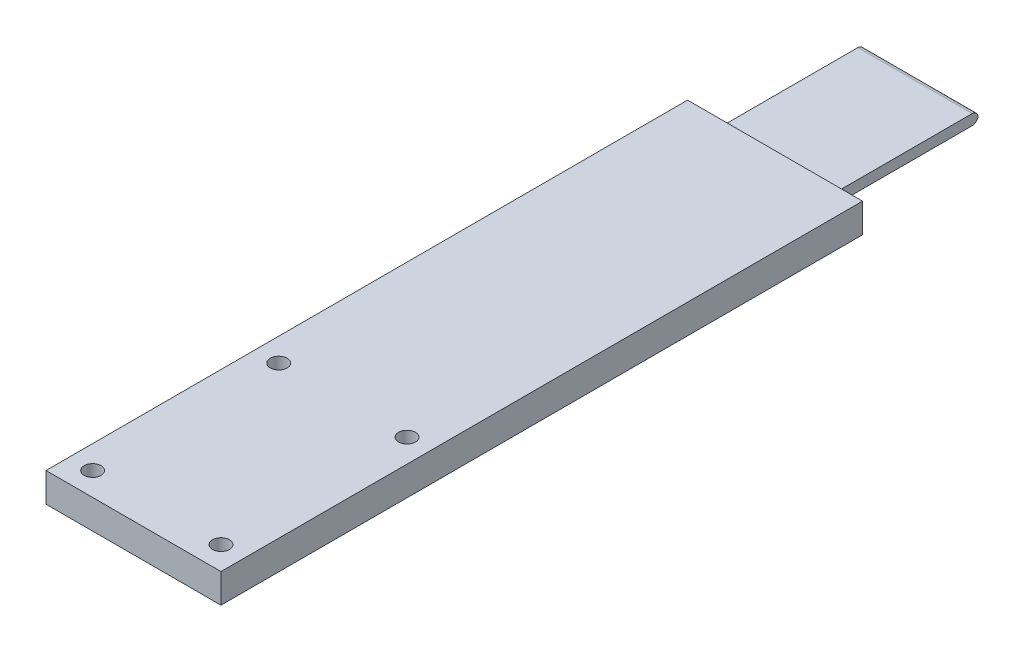
ISO-10303-21;
HEADER;
FILE_DESCRIPTION(('STEP AP214'),'2;1');
FILE_NAME('part.step','',(''),(''),'','','');
FILE_SCHEMA(('AUTOMOTIVE_DESIGN { 1 0 10303 214 1 1 1 1 }'));
ENDSEC;
DATA;
#1=APPLICATION_CONTEXT('core data for automotive mechanical design processes');
#2=APPLICATION_PROTOCOL_DEFINITION('international standard','automotive_design',2000,#1);
#3=PRODUCT_CONTEXT('',#1,'mechanical');
#4=PRODUCT('Part','Part','',(#3));
#5=PRODUCT_RELATED_PRODUCT_CATEGORY('part','',(#4));
#6=PRODUCT_DEFINITION_FORMATION('','',#4);
#7=PRODUCT_DEFINITION_CONTEXT('part definition',#1,'design');
#8=PRODUCT_DEFINITION('design','',#6,#7);
#9=PRODUCT_DEFINITION_SHAPE('','',#8);
#10=(LENGTH_UNIT() NAMED_UNIT(*) SI_UNIT(.MILLI.,.METRE.));
#11=(NAMED_UNIT(*) PLANE_ANGLE_UNIT() SI_UNIT($,.RADIAN.));
#12=(NAMED_UNIT(*) SI_UNIT($,.STERADIAN.) SOLID_ANGLE_UNIT());
#13=UNCERTAINTY_MEASURE_WITH_UNIT(LENGTH_MEASURE(1.E-05),#10,'distance_accuracy_value','');
#14=(GEOMETRIC_REPRESENTATION_CONTEXT(3) GLOBAL_UNCERTAINTY_ASSIGNED_CONTEXT((#13)) GLOBAL_UNIT_ASSIGNED_CONTEXT((#10,
#11,#12)) REPRESENTATION_CONTEXT('',''));
#15=CARTESIAN_POINT('',(0.,0.,0.));
#16=DIRECTION('',(0.,0.,1.));
#17=DIRECTION('',(1.,0.,0.));
#18=AXIS2_PLACEMENT_3D('',#15,#16,#17);
#19=CARTESIAN_POINT('',(0.,0.,0.));
#20=DIRECTION('',(0.,0.,1.));
#21=DIRECTION('',(1.,0.,0.));
#22=AXIS2_PLACEMENT_3D('',#19,#20,#21);
#23=PLANE('',#22);
#24=DIRECTION('',(0.,1.,0.));
#25=VECTOR('',#24,1.);
#26=CARTESIAN_POINT('',(0.,0.,0.));
#27=LINE('',#26,#25);
#28=CARTESIAN_POINT('',(0.,0.,0.));
#29=VERTEX_POINT('',#28);
#30=CARTESIAN_POINT('',(0.,5.00000000000001,0.));
#31=VERTEX_POINT('',#30);
#32=EDGE_CURVE('E160',#29,#31,#27,.T.);
#33=ORIENTED_EDGE('',*,*,#32,.F.);
#34=DIRECTION('',(1.,0.,0.));
#35=VECTOR('',#34,1.);
#36=CARTESIAN_POINT('',(0.,0.,0.));
#37=LINE('',#36,#35);
#38=CARTESIAN_POINT('',(-30.,0.,0.));
#39=VERTEX_POINT('',#38);
#40=EDGE_CURVE('E153',#39,#29,#37,.T.);
#41=ORIENTED_EDGE('',*,*,#40,.F.);
#42=DIRECTION('',(0.,-1.,0.));
#43=VECTOR('',#42,1.);
#44=CARTESIAN_POINT('',(-30.,0.,0.));
#45=LINE('',#44,#43);
#46=CARTESIAN_POINT('',(-30.,5.,0.));
#47=VERTEX_POINT('',#46);
#48=EDGE_CURVE('E166',#47,#39,#45,.T.);
#49=ORIENTED_EDGE('',*,*,#48,.F.);
#50=DIRECTION('',(-1.,0.,0.));
#51=VECTOR('',#50,1.);
#52=CARTESIAN_POINT('',(0.,5.00000000000001,0.));
#53=LINE('',#52,#51);
#54=EDGE_CURVE('E163',#31,#47,#53,.T.);
#55=ORIENTED_EDGE('',*,*,#54,.F.);
#56=EDGE_LOOP('',(#33,#41,#49,#55));
#57=FACE_BOUND('',#56,.T.);
#58=DIRECTION('',(0.,-1.,0.));
#59=VECTOR('',#58,1.);
#60=CARTESIAN_POINT('',(-5.2,3.40000000000001,0.));
#61=LINE('',#60,#59);
#62=CARTESIAN_POINT('',(-5.2,3.40000000000001,0.));
#63=VERTEX_POINT('',#62);
#64=CARTESIAN_POINT('',(-5.2,1.6,0.));
#65=VERTEX_POINT('',#64);
#66=EDGE_CURVE('E127',#63,#65,#61,.T.);
#67=ORIENTED_EDGE('',*,*,#66,.F.);
#68=DIRECTION('',(1.,0.,0.));
#69=VECTOR('',#68,1.);
#70=CARTESIAN_POINT('',(-5.2,3.40000000000001,0.));
#71=LINE('',#70,#69);
#72=CARTESIAN_POINT('',(-24.8,3.40000000000001,0.));
#73=VERTEX_POINT('',#72);
#74=EDGE_CURVE('E124',#73,#63,#71,.T.);
#75=ORIENTED_EDGE('',*,*,#74,.F.);
#76=DIRECTION('',(0.,1.,0.));
#77=VECTOR('',#76,1.);
#78=CARTESIAN_POINT('',(-24.8,3.40000000000001,0.));
#79=LINE('',#78,#77);
#80=CARTESIAN_POINT('',(-24.8,1.6,0.));
#81=VERTEX_POINT('',#80);
#82=EDGE_CURVE('E107',#81,#73,#79,.T.);
#83=ORIENTED_EDGE('',*,*,#82,.F.);
#84=DIRECTION('',(-1.,0.,0.));
#85=VECTOR('',#84,1.);
#86=CARTESIAN_POINT('',(-5.2,1.6,0.));
#87=LINE('',#86,#85);
#88=EDGE_CURVE('E121',#65,#81,#87,.T.);
#89=ORIENTED_EDGE('',*,*,#88,.F.);
#90=EDGE_LOOP('',(#67,#75,#83,#89));
#91=FACE_BOUND('',#90,.T.);
#92=ADVANCED_FACE('F35',(#57,#91),#23,.F.);
#93=CARTESIAN_POINT('',(0.,0.,110.));
#94=DIRECTION('',(-1.,0.,0.));
#95=DIRECTION('',(0.,-1.,0.));
#96=AXIS2_PLACEMENT_3D('',#93,#94,#95);
#97=PLANE('',#96);
#98=ORIENTED_EDGE('',*,*,#32,.T.);
#99=DIRECTION('',(0.,0.,-1.));
#100=VECTOR('',#99,1.);
#101=CARTESIAN_POINT('',(0.,5.00000000000001,110.));
#102=LINE('',#101,#100);
#103=CARTESIAN_POINT('',(0.,5.00000000000001,110.));
#104=VERTEX_POINT('',#103);
#105=EDGE_CURVE('E177',#104,#31,#102,.T.);
#106=ORIENTED_EDGE('',*,*,#105,.F.);
#107=DIRECTION('',(0.,1.,0.));
#108=VECTOR('',#107,1.);
#109=CARTESIAN_POINT('',(0.,0.,110.));
#110=LINE('',#109,#108);
#111=CARTESIAN_POINT('',(0.,0.,110.));
#112=VERTEX_POINT('',#111);
#113=EDGE_CURVE('E149',#112,#104,#110,.T.);
#114=ORIENTED_EDGE('',*,*,#113,.F.);
#115=DIRECTION('',(0.,0.,-1.));
#116=VECTOR('',#115,1.);
#117=CARTESIAN_POINT('',(0.,0.,110.));
#118=LINE('',#117,#116);
#119=EDGE_CURVE('E159',#112,#29,#118,.T.);
#120=ORIENTED_EDGE('',*,*,#119,.T.);
#121=EDGE_LOOP('',(#98,#106,#114,#120));
#122=FACE_BOUND('',#121,.T.);
#123=ADVANCED_FACE('F212',(#122),#97,.F.);
#124=CARTESIAN_POINT('',(0.,5.00000000000001,110.));
#125=DIRECTION('',(0.,-1.,0.));
#126=DIRECTION('',(1.,0.,0.));
#127=AXIS2_PLACEMENT_3D('',#124,#125,#126);
#128=PLANE('',#127);
#129=CARTESIAN_POINT('',(-26.,5.,74.1));
#130=DIRECTION('',(0.,1.,0.));
#131=DIRECTION('',(-1.,0.,0.));
#132=AXIS2_PLACEMENT_3D('',#129,#130,#131);
#133=CIRCLE('',#132,1.45000000000001);
#134=CARTESIAN_POINT('',(-27.45,5.,74.1));
#135=VERTEX_POINT('',#134);
#136=EDGE_CURVE('E140',#135,#135,#133,.T.);
#137=ORIENTED_EDGE('',*,*,#136,.F.);
#138=EDGE_LOOP('',(#137));
#139=FACE_BOUND('',#138,.T.);
#140=CARTESIAN_POINT('',(-4.,5.,106.));
#141=DIRECTION('',(0.,1.,0.));
#142=DIRECTION('',(1.,0.,0.));
#143=AXIS2_PLACEMENT_3D('',#140,#141,#142);
#144=CIRCLE('',#143,1.45000000000001);
#145=CARTESIAN_POINT('',(-2.54999999999999,5.,106.));
#146=VERTEX_POINT('',#145);
#147=EDGE_CURVE('E139',#146,#146,#144,.T.);
#148=ORIENTED_EDGE('',*,*,#147,.F.);
#149=EDGE_LOOP('',(#148));
#150=FACE_BOUND('',#149,.T.);
#151=CARTESIAN_POINT('',(-4.,5.,74.1));
#152=DIRECTION('',(0.,1.,0.));
#153=DIRECTION('',(1.,0.,0.));
#154=AXIS2_PLACEMENT_3D('',#151,#152,#153);
#155=CIRCLE('',#154,1.45);
#156=CARTESIAN_POINT('',(-2.55,5.,74.1));
#157=VERTEX_POINT('',#156);
#158=EDGE_CURVE('E136',#157,#157,#155,.T.);
#159=ORIENTED_EDGE('',*,*,#158,.F.);
#160=EDGE_LOOP('',(#159));
#161=FACE_BOUND('',#160,.T.);
#162=CARTESIAN_POINT('',(-26.,5.,106.));
#163=DIRECTION('',(0.,1.,0.));
#164=DIRECTION('',(-1.,0.,0.));
#165=AXIS2_PLACEMENT_3D('',#162,#163,#164);
#166=CIRCLE('',#165,1.45000000000001);
#167=CARTESIAN_POINT('',(-27.45,5.,106.));
#168=VERTEX_POINT('',#167);
#169=EDGE_CURVE('E143',#168,#168,#166,.T.);
#170=ORIENTED_EDGE('',*,*,#169,.F.);
#171=EDGE_LOOP('',(#170));
#172=FACE_BOUND('',#171,.T.);
#173=ORIENTED_EDGE('',*,*,#54,.T.);
#174=DIRECTION('',(0.,0.,-1.));
#175=VECTOR('',#174,1.);
#176=CARTESIAN_POINT('',(-30.,5.,110.));
#177=LINE('',#176,#175);
#178=CARTESIAN_POINT('',(-30.,5.,110.));
#179=VERTEX_POINT('',#178);
#180=EDGE_CURVE('E174',#179,#47,#177,.T.);
#181=ORIENTED_EDGE('',*,*,#180,.F.);
#182=DIRECTION('',(-1.,0.,0.));
#183=VECTOR('',#182,1.);
#184=CARTESIAN_POINT('',(0.,5.00000000000001,110.));
#185=LINE('',#184,#183);
#186=EDGE_CURVE('E152',#104,#179,#185,.T.);
#187=ORIENTED_EDGE('',*,*,#186,.F.);
#188=ORIENTED_EDGE('',*,*,#105,.T.);
#189=EDGE_LOOP('',(#173,#181,#187,#188));
#190=FACE_BOUND('',#189,.T.);
#191=ADVANCED_FACE('F218',(#139,#150,#161,#172,#190),#128,.F.);
#192=CARTESIAN_POINT('',(-30.,0.,110.));
#193=DIRECTION('',(1.,0.,0.));
#194=DIRECTION('',(0.,0.,-1.));
#195=AXIS2_PLACEMENT_3D('',#192,#193,#194);
#196=PLANE('',#195);
#197=ORIENTED_EDGE('',*,*,#48,.T.);
#198=DIRECTION('',(0.,0.,-1.));
#199=VECTOR('',#198,1.);
#200=CARTESIAN_POINT('',(-30.,0.,110.));
#201=LINE('',#200,#199);
#202=CARTESIAN_POINT('',(-30.,0.,110.));
#203=VERTEX_POINT('',#202);
#204=EDGE_CURVE('E171',#203,#39,#201,.T.);
#205=ORIENTED_EDGE('',*,*,#204,.F.);
#206=DIRECTION('',(0.,-1.,0.));
#207=VECTOR('',#206,1.);
#208=CARTESIAN_POINT('',(-30.,0.,110.));
#209=LINE('',#208,#207);
#210=EDGE_CURVE('E155',#179,#203,#209,.T.);
#211=ORIENTED_EDGE('',*,*,#210,.F.);
#212=ORIENTED_EDGE('',*,*,#180,.T.);
#213=EDGE_LOOP('',(#197,#205,#211,#212));
#214=FACE_BOUND('',#213,.T.);
#215=ADVANCED_FACE('F228',(#214),#196,.F.);
#216=CARTESIAN_POINT('',(0.,0.,110.));
#217=DIRECTION('',(0.,1.,0.));
#218=DIRECTION('',(0.,0.,1.));
#219=AXIS2_PLACEMENT_3D('',#216,#217,#218);
#220=PLANE('',#219);
#221=CARTESIAN_POINT('',(-26.,0.,74.1));
#222=DIRECTION('',(0.,1.,0.));
#223=DIRECTION('',(0.,0.,1.));
#224=AXIS2_PLACEMENT_3D('',#221,#222,#223);
#225=CIRCLE('',#224,1.45000000000001);
#226=CARTESIAN_POINT('',(-26.,0.,75.55));
#227=VERTEX_POINT('',#226);
#228=EDGE_CURVE('E164',#227,#227,#225,.T.);
#229=ORIENTED_EDGE('',*,*,#228,.T.);
#230=EDGE_LOOP('',(#229));
#231=FACE_BOUND('',#230,.T.);
#232=CARTESIAN_POINT('',(-4.,0.,106.));
#233=DIRECTION('',(0.,1.,0.));
#234=DIRECTION('',(0.,0.,1.));
#235=AXIS2_PLACEMENT_3D('',#232,#233,#234);
#236=CIRCLE('',#235,1.45000000000001);
#237=CARTESIAN_POINT('',(-4.,0.,107.45));
#238=VERTEX_POINT('',#237);
#239=EDGE_CURVE('E186',#238,#238,#236,.T.);
#240=ORIENTED_EDGE('',*,*,#239,.T.);
#241=EDGE_LOOP('',(#240));
#242=FACE_BOUND('',#241,.T.);
#243=CARTESIAN_POINT('',(-4.,0.,74.1));
#244=DIRECTION('',(0.,1.,0.));
#245=DIRECTION('',(0.,0.,1.));
#246=AXIS2_PLACEMENT_3D('',#243,#244,#245);
#247=CIRCLE('',#246,1.45);
#248=CARTESIAN_POINT('',(-4.,0.,75.55));
#249=VERTEX_POINT('',#248);
#250=EDGE_CURVE('E183',#249,#249,#247,.T.);
#251=ORIENTED_EDGE('',*,*,#250,.T.);
#252=EDGE_LOOP('',(#251));
#253=FACE_BOUND('',#252,.T.);
#254=CARTESIAN_POINT('',(-26.,0.,106.));
#255=DIRECTION('',(0.,1.,0.));
#256=DIRECTION('',(0.,0.,1.));
#257=AXIS2_PLACEMENT_3D('',#254,#255,#256);
#258=CIRCLE('',#257,1.45000000000001);
#259=CARTESIAN_POINT('',(-26.,0.,107.45));
#260=VERTEX_POINT('',#259);
#261=EDGE_CURVE('E148',#260,#260,#258,.T.);
#262=ORIENTED_EDGE('',*,*,#261,.T.);
#263=EDGE_LOOP('',(#262));
#264=FACE_BOUND('',#263,.T.);
#265=ORIENTED_EDGE('',*,*,#40,.T.);
#266=ORIENTED_EDGE('',*,*,#119,.F.);
#267=DIRECTION('',(1.,0.,0.));
#268=VECTOR('',#267,1.);
#269=CARTESIAN_POINT('',(0.,0.,110.));
#270=LINE('',#269,#268);
#271=EDGE_CURVE('E157',#203,#112,#270,.T.);
#272=ORIENTED_EDGE('',*,*,#271,.F.);
#273=ORIENTED_EDGE('',*,*,#204,.T.);
#274=EDGE_LOOP('',(#265,#266,#272,#273));
#275=FACE_BOUND('',#274,.T.);
#276=ADVANCED_FACE('F225',(#231,#242,#253,#264,#275),#220,.F.);
#277=CARTESIAN_POINT('',(0.,0.,110.));
#278=DIRECTION('',(0.,0.,1.));
#279=DIRECTION('',(1.,0.,0.));
#280=AXIS2_PLACEMENT_3D('',#277,#278,#279);
#281=PLANE('',#280);
#282=ORIENTED_EDGE('',*,*,#113,.T.);
#283=ORIENTED_EDGE('',*,*,#186,.T.);
#284=ORIENTED_EDGE('',*,*,#210,.T.);
#285=ORIENTED_EDGE('',*,*,#271,.T.);
#286=EDGE_LOOP('',(#282,#283,#284,#285));
#287=FACE_BOUND('',#286,.T.);
#288=ADVANCED_FACE('F223',(#287),#281,.T.);
#289=CARTESIAN_POINT('',(-26.,-55.,106.));
#290=DIRECTION('',(0.,1.,0.));
#291=DIRECTION('',(-1.,0.,0.));
#292=AXIS2_PLACEMENT_3D('',#289,#290,#291);
#293=CYLINDRICAL_SURFACE('',#292,1.45000000000001);
#294=ORIENTED_EDGE('',*,*,#169,.T.);
#295=EDGE_LOOP('',(#294));
#296=FACE_BOUND('',#295,.T.);
#297=ORIENTED_EDGE('',*,*,#261,.F.);
#298=EDGE_LOOP('',(#297));
#299=FACE_BOUND('',#298,.T.);
#300=ADVANCED_FACE('F257',(#296,#299),#293,.F.);
#301=CARTESIAN_POINT('',(-3.99999999999999,-55.,74.1));
#302=DIRECTION('',(0.,1.,0.));
#303=DIRECTION('',(-1.,0.,0.));
#304=AXIS2_PLACEMENT_3D('',#301,#302,#303);
#305=CYLINDRICAL_SURFACE('',#304,1.45);
#306=ORIENTED_EDGE('',*,*,#158,.T.);
#307=EDGE_LOOP('',(#306));
#308=FACE_BOUND('',#307,.T.);
#309=ORIENTED_EDGE('',*,*,#250,.F.);
#310=EDGE_LOOP('',(#309));
#311=FACE_BOUND('',#310,.T.);
#312=ADVANCED_FACE('F261',(#308,#311),#305,.F.);
#313=CARTESIAN_POINT('',(-3.99999999999999,-55.,106.));
#314=DIRECTION('',(0.,1.,0.));
#315=DIRECTION('',(-1.,0.,0.));
#316=AXIS2_PLACEMENT_3D('',#313,#314,#315);
#317=CYLINDRICAL_SURFACE('',#316,1.45000000000001);
#318=ORIENTED_EDGE('',*,*,#147,.T.);
#319=EDGE_LOOP('',(#318));
#320=FACE_BOUND('',#319,.T.);
#321=ORIENTED_EDGE('',*,*,#239,.F.);
#322=EDGE_LOOP('',(#321));
#323=FACE_BOUND('',#322,.T.);
#324=ADVANCED_FACE('F266',(#320,#323),#317,.F.);
#325=CARTESIAN_POINT('',(-26.,-55.,74.1));
#326=DIRECTION('',(0.,1.,0.));
#327=DIRECTION('',(-1.,0.,0.));
#328=AXIS2_PLACEMENT_3D('',#325,#326,#327);
#329=CYLINDRICAL_SURFACE('',#328,1.45000000000001);
#330=ORIENTED_EDGE('',*,*,#136,.T.);
#331=EDGE_LOOP('',(#330));
#332=FACE_BOUND('',#331,.T.);
#333=ORIENTED_EDGE('',*,*,#228,.F.);
#334=EDGE_LOOP('',(#333));
#335=FACE_BOUND('',#334,.T.);
#336=ADVANCED_FACE('F273',(#332,#335),#329,.F.);
#337=CARTESIAN_POINT('',(-5.2,3.40000000000001,-25.));
#338=DIRECTION('',(-1.,0.,0.));
#339=DIRECTION('',(0.,0.,1.));
#340=AXIS2_PLACEMENT_3D('',#337,#338,#339);
#341=PLANE('',#340);
#342=DIRECTION('',(0.,0.,1.));
#343=VECTOR('',#342,1.);
#344=CARTESIAN_POINT('',(-5.2,1.6,-25.));
#345=LINE('',#344,#343);
#346=CARTESIAN_POINT('',(-5.2,1.6,-24.));
#347=VERTEX_POINT('',#346);
#348=EDGE_CURVE('E114',#347,#65,#345,.T.);
#349=ORIENTED_EDGE('',*,*,#348,.F.);
#350=CARTESIAN_POINT('',(-5.2,2.6,-24.));
#351=DIRECTION('',(-1.,0.,0.));
#352=DIRECTION('',(0.,0.,1.));
#353=AXIS2_PLACEMENT_3D('',#350,#351,#352);
#354=CIRCLE('',#353,1.);
#355=CARTESIAN_POINT('',(-5.2,2.5,-24.9949874371066));
#356=VERTEX_POINT('',#355);
#357=EDGE_CURVE('E44',#347,#356,#354,.F.);
#358=ORIENTED_EDGE('',*,*,#357,.T.);
#359=CARTESIAN_POINT('',(-5.2,2.40000000000001,-24.));
#360=DIRECTION('',(-1.,0.,0.));
#361=DIRECTION('',(0.,0.,1.));
#362=AXIS2_PLACEMENT_3D('',#359,#360,#361);
#363=CIRCLE('',#362,1.);
#364=CARTESIAN_POINT('',(-5.2,3.40000000000001,-24.));
#365=VERTEX_POINT('',#364);
#366=EDGE_CURVE('E54',#356,#365,#363,.F.);
#367=ORIENTED_EDGE('',*,*,#366,.T.);
#368=DIRECTION('',(0.,0.,1.));
#369=VECTOR('',#368,1.);
#370=CARTESIAN_POINT('',(-5.2,3.40000000000001,-25.));
#371=LINE('',#370,#369);
#372=EDGE_CURVE('E132',#365,#63,#371,.T.);
#373=ORIENTED_EDGE('',*,*,#372,.T.);
#374=ORIENTED_EDGE('',*,*,#66,.T.);
#375=EDGE_LOOP('',(#349,#358,#367,#373,#374));
#376=FACE_BOUND('',#375,.T.);
#377=ADVANCED_FACE('F197',(#376),#341,.F.);
#378=CARTESIAN_POINT('',(-5.2,1.6,-25.));
#379=DIRECTION('',(0.,1.,0.));
#380=DIRECTION('',(0.,0.,1.));
#381=AXIS2_PLACEMENT_3D('',#378,#379,#380);
#382=PLANE('',#381);
#383=DIRECTION('',(0.,0.,1.));
#384=VECTOR('',#383,1.);
#385=CARTESIAN_POINT('',(-24.8,1.6,-25.));
#386=LINE('',#385,#384);
#387=CARTESIAN_POINT('',(-24.8,1.6,-24.));
#388=VERTEX_POINT('',#387);
#389=EDGE_CURVE('E103',#388,#81,#386,.T.);
#390=ORIENTED_EDGE('',*,*,#389,.F.);
#391=DIRECTION('',(-1.,0.,0.));
#392=VECTOR('',#391,1.);
#393=CARTESIAN_POINT('',(-5.2,1.6,-24.));
#394=LINE('',#393,#392);
#395=EDGE_CURVE('E193',#388,#347,#394,.F.);
#396=ORIENTED_EDGE('',*,*,#395,.T.);
#397=ORIENTED_EDGE('',*,*,#348,.T.);
#398=ORIENTED_EDGE('',*,*,#88,.T.);
#399=EDGE_LOOP('',(#390,#396,#397,#398));
#400=FACE_BOUND('',#399,.T.);
#401=ADVANCED_FACE('F126',(#400),#382,.F.);
#402=CARTESIAN_POINT('',(-24.8,3.40000000000001,-25.));
#403=DIRECTION('',(1.,0.,0.));
#404=DIRECTION('',(0.,0.,-1.));
#405=AXIS2_PLACEMENT_3D('',#402,#403,#404);
#406=PLANE('',#405);
#407=CARTESIAN_POINT('',(-24.8,2.40000000000001,-24.));
#408=DIRECTION('',(1.,0.,0.));
#409=DIRECTION('',(0.,0.,-1.));
#410=AXIS2_PLACEMENT_3D('',#407,#408,#409);
#411=CIRCLE('',#410,1.);
#412=CARTESIAN_POINT('',(-24.8,3.40000000000001,-24.));
#413=VERTEX_POINT('',#412);
#414=CARTESIAN_POINT('',(-24.8,2.5,-24.9949874371066));
#415=VERTEX_POINT('',#414);
#416=EDGE_CURVE('E180',#413,#415,#411,.F.);
#417=ORIENTED_EDGE('',*,*,#416,.T.);
#418=CARTESIAN_POINT('',(-24.8,2.6,-24.));
#419=DIRECTION('',(1.,0.,0.));
#420=DIRECTION('',(0.,0.,-1.));
#421=AXIS2_PLACEMENT_3D('',#418,#419,#420);
#422=CIRCLE('',#421,1.);
#423=EDGE_CURVE('E109',#415,#388,#422,.F.);
#424=ORIENTED_EDGE('',*,*,#423,.T.);
#425=ORIENTED_EDGE('',*,*,#389,.T.);
#426=ORIENTED_EDGE('',*,*,#82,.T.);
#427=DIRECTION('',(0.,0.,1.));
#428=VECTOR('',#427,1.);
#429=CARTESIAN_POINT('',(-24.8,3.40000000000001,-25.));
#430=LINE('',#429,#428);
#431=EDGE_CURVE('E115',#413,#73,#430,.T.);
#432=ORIENTED_EDGE('',*,*,#431,.F.);
#433=EDGE_LOOP('',(#417,#424,#425,#426,#432));
#434=FACE_BOUND('',#433,.T.);
#435=ADVANCED_FACE('F105',(#434),#406,.F.);
#436=CARTESIAN_POINT('',(-5.2,3.40000000000001,-25.));
#437=DIRECTION('',(0.,-1.,0.));
#438=DIRECTION('',(0.,0.,-1.));
#439=AXIS2_PLACEMENT_3D('',#436,#437,#438);
#440=PLANE('',#439);
#441=ORIENTED_EDGE('',*,*,#372,.F.);
#442=DIRECTION('',(1.,0.,0.));
#443=VECTOR('',#442,1.);
#444=CARTESIAN_POINT('',(-24.8,3.40000000000001,-24.));
#445=LINE('',#444,#443);
#446=EDGE_CURVE('E11',#365,#413,#445,.F.);
#447=ORIENTED_EDGE('',*,*,#446,.T.);
#448=ORIENTED_EDGE('',*,*,#431,.T.);
#449=ORIENTED_EDGE('',*,*,#74,.T.);
#450=EDGE_LOOP('',(#441,#447,#448,#449));
#451=FACE_BOUND('',#450,.T.);
#452=ADVANCED_FACE('F199',(#451),#440,.F.);
#453=CARTESIAN_POINT('',(0.,2.40000000000001,-24.));
#454=DIRECTION('',(-1.,0.,0.));
#455=DIRECTION('',(0.,0.,1.));
#456=AXIS2_PLACEMENT_3D('',#453,#454,#455);
#457=CYLINDRICAL_SURFACE('',#456,1.);
#458=ORIENTED_EDGE('',*,*,#446,.F.);
#459=ORIENTED_EDGE('',*,*,#366,.F.);
#460=DIRECTION('',(-1.,0.,0.));
#461=VECTOR('',#460,1.);
#462=CARTESIAN_POINT('',(-15.,2.5,-24.9949874371066));
#463=LINE('',#462,#461);
#464=EDGE_CURVE('E39',#415,#356,#463,.F.);
#465=ORIENTED_EDGE('',*,*,#464,.F.);
#466=ORIENTED_EDGE('',*,*,#416,.F.);
#467=EDGE_LOOP('',(#458,#459,#465,#466));
#468=FACE_BOUND('',#467,.T.);
#469=ADVANCED_FACE('F37',(#468),#457,.T.);
#470=CARTESIAN_POINT('',(0.,2.6,-24.));
#471=DIRECTION('',(1.,0.,0.));
#472=DIRECTION('',(0.,0.,-1.));
#473=AXIS2_PLACEMENT_3D('',#470,#471,#472);
#474=CYLINDRICAL_SURFACE('',#473,1.);
#475=ORIENTED_EDGE('',*,*,#357,.F.);
#476=ORIENTED_EDGE('',*,*,#395,.F.);
#477=ORIENTED_EDGE('',*,*,#423,.F.);
#478=ORIENTED_EDGE('',*,*,#464,.T.);
#479=EDGE_LOOP('',(#475,#476,#477,#478));
#480=FACE_BOUND('',#479,.T.);
#481=ADVANCED_FACE('F205',(#480),#474,.T.);
#482=CLOSED_SHELL('',(#92,#123,#191,#215,#276,#288,#300,#312,#324,#336,#377,#401,#435,#452,#469,#481));
#483=MANIFOLD_SOLID_BREP('B2',#482);
#484=ADVANCED_BREP_SHAPE_REPRESENTATION('',(#18,#483),#14);
#485=SHAPE_DEFINITION_REPRESENTATION(#9,#484);
ENDSEC;
END-ISO-10303-21;
